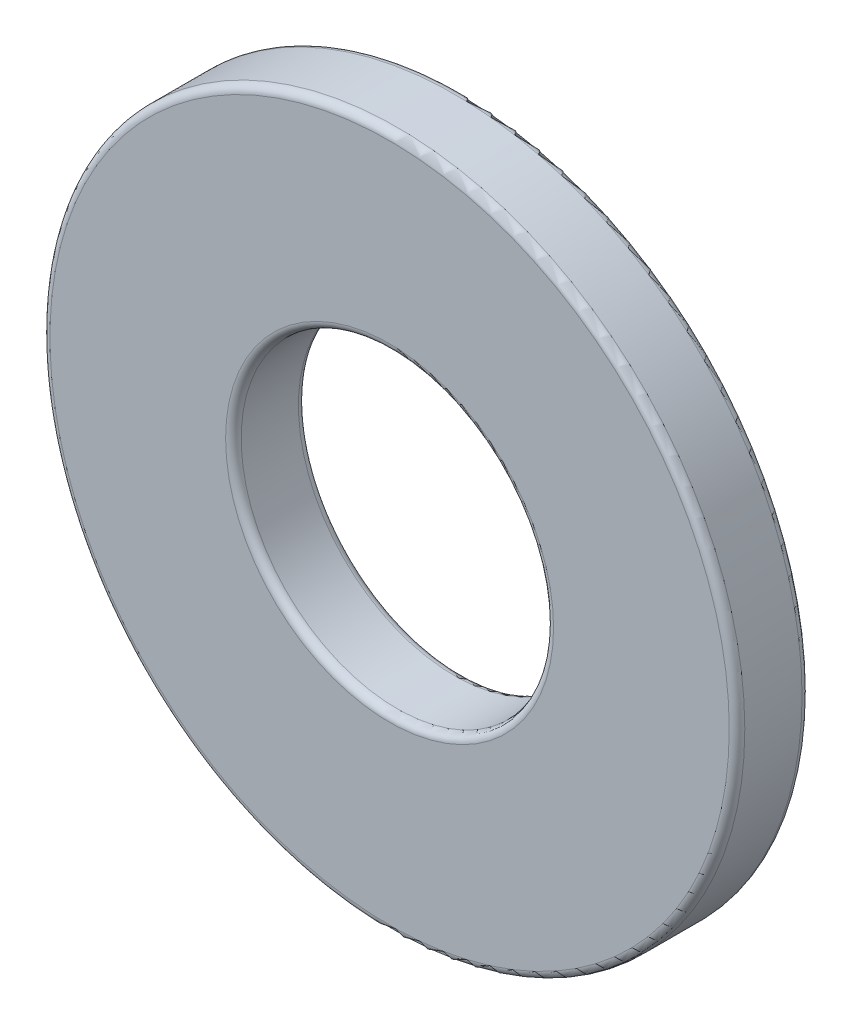
ISO-10303-21;
HEADER;
FILE_DESCRIPTION(('STEP AP214'),'2;1');
FILE_NAME('part.step','',(''),(''),'','','');
FILE_SCHEMA(('AUTOMOTIVE_DESIGN { 1 0 10303 214 1 1 1 1 }'));
ENDSEC;
DATA;
#1=APPLICATION_CONTEXT('core data for automotive mechanical design processes');
#2=APPLICATION_PROTOCOL_DEFINITION('international standard','automotive_design',2000,#1);
#3=PRODUCT_CONTEXT('',#1,'mechanical');
#4=PRODUCT('Part','Part','',(#3));
#5=PRODUCT_RELATED_PRODUCT_CATEGORY('part','',(#4));
#6=PRODUCT_DEFINITION_FORMATION('','',#4);
#7=PRODUCT_DEFINITION_CONTEXT('part definition',#1,'design');
#8=PRODUCT_DEFINITION('design','',#6,#7);
#9=PRODUCT_DEFINITION_SHAPE('','',#8);
#10=(LENGTH_UNIT() NAMED_UNIT(*) SI_UNIT(.MILLI.,.METRE.));
#11=(NAMED_UNIT(*) PLANE_ANGLE_UNIT() SI_UNIT($,.RADIAN.));
#12=(NAMED_UNIT(*) SI_UNIT($,.STERADIAN.) SOLID_ANGLE_UNIT());
#13=UNCERTAINTY_MEASURE_WITH_UNIT(LENGTH_MEASURE(1.E-05),#10,'distance_accuracy_value','');
#14=(GEOMETRIC_REPRESENTATION_CONTEXT(3) GLOBAL_UNCERTAINTY_ASSIGNED_CONTEXT((#13)) GLOBAL_UNIT_ASSIGNED_CONTEXT((#10,
#11,#12)) REPRESENTATION_CONTEXT('',''));
#15=CARTESIAN_POINT('',(0.,0.,0.));
#16=DIRECTION('',(0.,0.,1.));
#17=DIRECTION('',(1.,0.,0.));
#18=AXIS2_PLACEMENT_3D('',#15,#16,#17);
#19=CARTESIAN_POINT('',(0.,0.,-0.83185));
#20=DIRECTION('',(0.,0.,-1.));
#21=DIRECTION('',(1.,0.,0.));
#22=AXIS2_PLACEMENT_3D('',#19,#20,#21);
#23=PLANE('',#22);
#24=CARTESIAN_POINT('',(0.,0.,-0.83185));
#25=DIRECTION('',(0.,0.,1.));
#26=DIRECTION('',(1.,0.,0.));
#27=AXIS2_PLACEMENT_3D('',#24,#25,#26);
#28=CIRCLE('',#27,3.7465);
#29=CARTESIAN_POINT('',(3.7465,0.,-0.83185));
#30=VERTEX_POINT('',#29);
#31=EDGE_CURVE('E61',#30,#30,#28,.F.);
#32=ORIENTED_EDGE('',*,*,#31,.F.);
#33=EDGE_LOOP('',(#32));
#34=FACE_BOUND('',#33,.T.);
#35=CARTESIAN_POINT('',(0.,0.,-0.83185));
#36=DIRECTION('',(0.,0.,1.));
#37=DIRECTION('',(1.,0.,0.));
#38=AXIS2_PLACEMENT_3D('',#35,#36,#37);
#39=CIRCLE('',#38,7.7597);
#40=CARTESIAN_POINT('',(7.7597,0.,-0.83185));
#41=VERTEX_POINT('',#40);
#42=EDGE_CURVE('E64',#41,#41,#39,.T.);
#43=ORIENTED_EDGE('',*,*,#42,.F.);
#44=EDGE_LOOP('',(#43));
#45=FACE_BOUND('',#44,.T.);
#46=ADVANCED_FACE('F41',(#34,#45),#23,.T.);
#47=CARTESIAN_POINT('',(0.,0.,0.83185));
#48=DIRECTION('',(0.,0.,-1.));
#49=DIRECTION('',(1.,0.,0.));
#50=AXIS2_PLACEMENT_3D('',#47,#48,#49);
#51=PLANE('',#50);
#52=CARTESIAN_POINT('',(0.,0.,0.83185));
#53=DIRECTION('',(0.,0.,1.));
#54=DIRECTION('',(1.,0.,0.));
#55=AXIS2_PLACEMENT_3D('',#52,#53,#54);
#56=CIRCLE('',#55,3.7465);
#57=CARTESIAN_POINT('',(3.7465,0.,0.83185));
#58=VERTEX_POINT('',#57);
#59=EDGE_CURVE('E10',#58,#58,#56,.T.);
#60=ORIENTED_EDGE('',*,*,#59,.F.);
#61=EDGE_LOOP('',(#60));
#62=FACE_BOUND('',#61,.T.);
#63=CARTESIAN_POINT('',(0.,0.,0.83185));
#64=DIRECTION('',(0.,0.,1.));
#65=DIRECTION('',(1.,0.,0.));
#66=AXIS2_PLACEMENT_3D('',#63,#64,#65);
#67=CIRCLE('',#66,7.7597);
#68=CARTESIAN_POINT('',(7.7597,0.,0.83185));
#69=VERTEX_POINT('',#68);
#70=EDGE_CURVE('E48',#69,#69,#67,.F.);
#71=ORIENTED_EDGE('',*,*,#70,.F.);
#72=EDGE_LOOP('',(#71));
#73=FACE_BOUND('',#72,.T.);
#74=ADVANCED_FACE('F89',(#62,#73),#51,.F.);
#75=CARTESIAN_POINT('',(0.,0.,-0.83185));
#76=DIRECTION('',(0.,0.,1.));
#77=DIRECTION('',(-1.,0.,0.));
#78=AXIS2_PLACEMENT_3D('',#75,#76,#77);
#79=CYLINDRICAL_SURFACE('',#78,7.9375);
#80=CARTESIAN_POINT('',(0.,0.,-0.65405));
#81=DIRECTION('',(0.,0.,1.));
#82=DIRECTION('',(1.,0.,0.));
#83=AXIS2_PLACEMENT_3D('',#80,#81,#82);
#84=CIRCLE('',#83,7.9375);
#85=CARTESIAN_POINT('',(7.9375,0.,-0.65405));
#86=VERTEX_POINT('',#85);
#87=EDGE_CURVE('E52',#86,#86,#84,.F.);
#88=ORIENTED_EDGE('',*,*,#87,.F.);
#89=EDGE_LOOP('',(#88));
#90=FACE_BOUND('',#89,.T.);
#91=CARTESIAN_POINT('',(0.,0.,0.65405));
#92=DIRECTION('',(0.,0.,1.));
#93=DIRECTION('',(1.,0.,0.));
#94=AXIS2_PLACEMENT_3D('',#91,#92,#93);
#95=CIRCLE('',#94,7.9375);
#96=CARTESIAN_POINT('',(7.9375,0.,0.65405));
#97=VERTEX_POINT('',#96);
#98=EDGE_CURVE('E56',#97,#97,#95,.T.);
#99=ORIENTED_EDGE('',*,*,#98,.F.);
#100=EDGE_LOOP('',(#99));
#101=FACE_BOUND('',#100,.T.);
#102=ADVANCED_FACE('F79',(#90,#101),#79,.T.);
#103=CARTESIAN_POINT('',(0.,0.,-0.83185));
#104=DIRECTION('',(0.,0.,1.));
#105=DIRECTION('',(-1.,0.,0.));
#106=AXIS2_PLACEMENT_3D('',#103,#104,#105);
#107=CYLINDRICAL_SURFACE('',#106,3.5687);
#108=CARTESIAN_POINT('',(0.,0.,-0.65405));
#109=DIRECTION('',(0.,0.,1.));
#110=DIRECTION('',(1.,0.,0.));
#111=AXIS2_PLACEMENT_3D('',#108,#109,#110);
#112=CIRCLE('',#111,3.5687);
#113=CARTESIAN_POINT('',(3.5687,0.,-0.65405));
#114=VERTEX_POINT('',#113);
#115=EDGE_CURVE('E67',#114,#114,#112,.T.);
#116=ORIENTED_EDGE('',*,*,#115,.F.);
#117=EDGE_LOOP('',(#116));
#118=FACE_BOUND('',#117,.T.);
#119=CARTESIAN_POINT('',(0.,0.,0.65405));
#120=DIRECTION('',(0.,0.,1.));
#121=DIRECTION('',(1.,0.,0.));
#122=AXIS2_PLACEMENT_3D('',#119,#120,#121);
#123=CIRCLE('',#122,3.5687);
#124=CARTESIAN_POINT('',(3.5687,0.,0.65405));
#125=VERTEX_POINT('',#124);
#126=EDGE_CURVE('E70',#125,#125,#123,.F.);
#127=ORIENTED_EDGE('',*,*,#126,.F.);
#128=EDGE_LOOP('',(#127));
#129=FACE_BOUND('',#128,.T.);
#130=ADVANCED_FACE('F76',(#118,#129),#107,.F.);
#131=CARTESIAN_POINT('',(0.,0.,-0.65405));
#132=DIRECTION('',(0.,0.,-1.));
#133=DIRECTION('',(1.,0.,0.));
#134=AXIS2_PLACEMENT_3D('',#131,#132,#133);
#135=TOROIDAL_SURFACE('',#134,3.7465,0.1778);
#136=ORIENTED_EDGE('',*,*,#31,.T.);
#137=EDGE_LOOP('',(#136));
#138=FACE_BOUND('',#137,.T.);
#139=ORIENTED_EDGE('',*,*,#115,.T.);
#140=EDGE_LOOP('',(#139));
#141=FACE_BOUND('',#140,.T.);
#142=ADVANCED_FACE('F78',(#138,#141),#135,.T.);
#143=CARTESIAN_POINT('',(0.,0.,-0.65405));
#144=DIRECTION('',(0.,0.,-1.));
#145=DIRECTION('',(1.,0.,0.));
#146=AXIS2_PLACEMENT_3D('',#143,#144,#145);
#147=TOROIDAL_SURFACE('',#146,7.7597,0.1778);
#148=ORIENTED_EDGE('',*,*,#87,.T.);
#149=EDGE_LOOP('',(#148));
#150=FACE_BOUND('',#149,.T.);
#151=ORIENTED_EDGE('',*,*,#42,.T.);
#152=EDGE_LOOP('',(#151));
#153=FACE_BOUND('',#152,.T.);
#154=ADVANCED_FACE('F86',(#150,#153),#147,.T.);
#155=CARTESIAN_POINT('',(0.,0.,0.65405));
#156=DIRECTION('',(0.,0.,-1.));
#157=DIRECTION('',(1.,0.,0.));
#158=AXIS2_PLACEMENT_3D('',#155,#156,#157);
#159=TOROIDAL_SURFACE('',#158,3.7465,0.1778);
#160=ORIENTED_EDGE('',*,*,#126,.T.);
#161=EDGE_LOOP('',(#160));
#162=FACE_BOUND('',#161,.T.);
#163=ORIENTED_EDGE('',*,*,#59,.T.);
#164=EDGE_LOOP('',(#163));
#165=FACE_BOUND('',#164,.T.);
#166=ADVANCED_FACE('F74',(#162,#165),#159,.T.);
#167=CARTESIAN_POINT('',(0.,0.,0.65405));
#168=DIRECTION('',(0.,0.,-1.));
#169=DIRECTION('',(1.,0.,0.));
#170=AXIS2_PLACEMENT_3D('',#167,#168,#169);
#171=TOROIDAL_SURFACE('',#170,7.7597,0.1778);
#172=ORIENTED_EDGE('',*,*,#70,.T.);
#173=EDGE_LOOP('',(#172));
#174=FACE_BOUND('',#173,.T.);
#175=ORIENTED_EDGE('',*,*,#98,.T.);
#176=EDGE_LOOP('',(#175));
#177=FACE_BOUND('',#176,.T.);
#178=ADVANCED_FACE('F43',(#174,#177),#171,.T.);
#179=CLOSED_SHELL('',(#46,#74,#102,#130,#142,#154,#166,#178));
#180=MANIFOLD_SOLID_BREP('B2',#179);
#181=ADVANCED_BREP_SHAPE_REPRESENTATION('',(#18,#180),#14);
#182=SHAPE_DEFINITION_REPRESENTATION(#9,#181);
ENDSEC;
END-ISO-10303-21;
